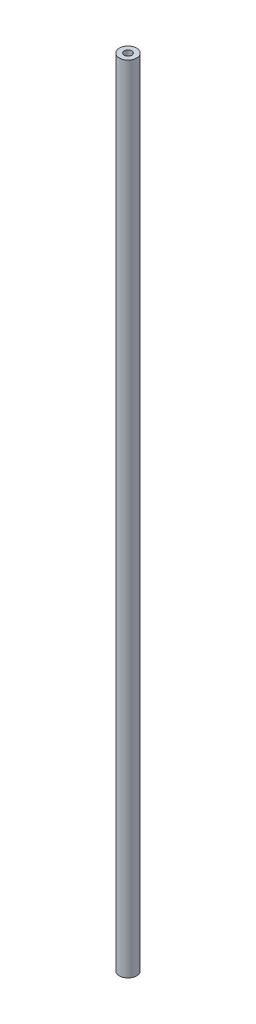
ISO-10303-21;
HEADER;
FILE_DESCRIPTION(('STEP AP214'),'2;1');
FILE_NAME('part.step','',(''),(''),'','','');
FILE_SCHEMA(('AUTOMOTIVE_DESIGN { 1 0 10303 214 1 1 1 1 }'));
ENDSEC;
DATA;
#1=APPLICATION_CONTEXT('core data for automotive mechanical design processes');
#2=APPLICATION_PROTOCOL_DEFINITION('international standard','automotive_design',2000,#1);
#3=PRODUCT_CONTEXT('',#1,'mechanical');
#4=PRODUCT('Part','Part','',(#3));
#5=PRODUCT_RELATED_PRODUCT_CATEGORY('part','',(#4));
#6=PRODUCT_DEFINITION_FORMATION('','',#4);
#7=PRODUCT_DEFINITION_CONTEXT('part definition',#1,'design');
#8=PRODUCT_DEFINITION('design','',#6,#7);
#9=PRODUCT_DEFINITION_SHAPE('','',#8);
#10=(LENGTH_UNIT() NAMED_UNIT(*) SI_UNIT(.MILLI.,.METRE.));
#11=(NAMED_UNIT(*) PLANE_ANGLE_UNIT() SI_UNIT($,.RADIAN.));
#12=(NAMED_UNIT(*) SI_UNIT($,.STERADIAN.) SOLID_ANGLE_UNIT());
#13=UNCERTAINTY_MEASURE_WITH_UNIT(LENGTH_MEASURE(1.E-05),#10,'distance_accuracy_value','');
#14=(GEOMETRIC_REPRESENTATION_CONTEXT(3) GLOBAL_UNCERTAINTY_ASSIGNED_CONTEXT((#13)) GLOBAL_UNIT_ASSIGNED_CONTEXT((#10,
#11,#12)) REPRESENTATION_CONTEXT('',''));
#15=CARTESIAN_POINT('',(0.,0.,0.));
#16=DIRECTION('',(0.,0.,1.));
#17=DIRECTION('',(1.,0.,0.));
#18=AXIS2_PLACEMENT_3D('',#15,#16,#17);
#19=CARTESIAN_POINT('',(0.,23.,0.));
#20=DIRECTION('',(0.,1.,0.));
#21=DIRECTION('',(0.,0.,1.));
#22=AXIS2_PLACEMENT_3D('',#19,#20,#21);
#23=PLANE('',#22);
#24=CARTESIAN_POINT('',(0.,23.,0.));
#25=DIRECTION('',(0.,1.,0.));
#26=DIRECTION('',(0.,0.,1.));
#27=AXIS2_PLACEMENT_3D('',#24,#25,#26);
#28=CIRCLE('',#27,0.25);
#29=CARTESIAN_POINT('',(0.,23.,0.25));
#30=VERTEX_POINT('',#29);
#31=EDGE_CURVE('E10',#30,#30,#28,.T.);
#32=ORIENTED_EDGE('',*,*,#31,.T.);
#33=EDGE_LOOP('',(#32));
#34=FACE_BOUND('',#33,.T.);
#35=CARTESIAN_POINT('',(0.,23.,0.));
#36=DIRECTION('',(0.,1.,0.));
#37=DIRECTION('',(0.,0.,1.));
#38=AXIS2_PLACEMENT_3D('',#35,#36,#37);
#39=CIRCLE('',#38,0.11);
#40=CARTESIAN_POINT('',(0.,23.,0.11));
#41=VERTEX_POINT('',#40);
#42=EDGE_CURVE('E42',#41,#41,#39,.T.);
#43=ORIENTED_EDGE('',*,*,#42,.F.);
#44=EDGE_LOOP('',(#43));
#45=FACE_BOUND('',#44,.T.);
#46=ADVANCED_FACE('F31',(#34,#45),#23,.T.);
#47=CARTESIAN_POINT('',(0.,0.,0.));
#48=DIRECTION('',(0.,1.,0.));
#49=DIRECTION('',(0.,0.,1.));
#50=AXIS2_PLACEMENT_3D('',#47,#48,#49);
#51=PLANE('',#50);
#52=CARTESIAN_POINT('',(0.,0.,0.));
#53=DIRECTION('',(0.,1.,0.));
#54=DIRECTION('',(0.,0.,1.));
#55=AXIS2_PLACEMENT_3D('',#52,#53,#54);
#56=CIRCLE('',#55,0.25);
#57=CARTESIAN_POINT('',(0.,0.,0.25));
#58=VERTEX_POINT('',#57);
#59=EDGE_CURVE('E35',#58,#58,#56,.T.);
#60=ORIENTED_EDGE('',*,*,#59,.F.);
#61=EDGE_LOOP('',(#60));
#62=FACE_BOUND('',#61,.T.);
#63=CARTESIAN_POINT('',(0.,0.,0.));
#64=DIRECTION('',(0.,1.,0.));
#65=DIRECTION('',(0.,0.,1.));
#66=AXIS2_PLACEMENT_3D('',#63,#64,#65);
#67=CIRCLE('',#66,0.11);
#68=CARTESIAN_POINT('',(0.,0.,0.11));
#69=VERTEX_POINT('',#68);
#70=EDGE_CURVE('E44',#69,#69,#67,.T.);
#71=ORIENTED_EDGE('',*,*,#70,.T.);
#72=EDGE_LOOP('',(#71));
#73=FACE_BOUND('',#72,.T.);
#74=ADVANCED_FACE('F54',(#62,#73),#51,.F.);
#75=CARTESIAN_POINT('',(0.,23.,0.));
#76=DIRECTION('',(0.,-1.,0.));
#77=DIRECTION('',(0.,0.,-1.));
#78=AXIS2_PLACEMENT_3D('',#75,#76,#77);
#79=CYLINDRICAL_SURFACE('',#78,0.25);
#80=ORIENTED_EDGE('',*,*,#31,.F.);
#81=EDGE_LOOP('',(#80));
#82=FACE_BOUND('',#81,.T.);
#83=ORIENTED_EDGE('',*,*,#59,.T.);
#84=EDGE_LOOP('',(#83));
#85=FACE_BOUND('',#84,.T.);
#86=ADVANCED_FACE('F33',(#82,#85),#79,.T.);
#87=CARTESIAN_POINT('',(0.,23.,0.));
#88=DIRECTION('',(0.,-1.,0.));
#89=DIRECTION('',(0.,0.,-1.));
#90=AXIS2_PLACEMENT_3D('',#87,#88,#89);
#91=CYLINDRICAL_SURFACE('',#90,0.11);
#92=ORIENTED_EDGE('',*,*,#42,.T.);
#93=EDGE_LOOP('',(#92));
#94=FACE_BOUND('',#93,.T.);
#95=ORIENTED_EDGE('',*,*,#70,.F.);
#96=EDGE_LOOP('',(#95));
#97=FACE_BOUND('',#96,.T.);
#98=ADVANCED_FACE('F50',(#94,#97),#91,.F.);
#99=CLOSED_SHELL('',(#46,#74,#86,#98));
#100=MANIFOLD_SOLID_BREP('B2',#99);
#101=ADVANCED_BREP_SHAPE_REPRESENTATION('',(#18,#100),#14);
#102=SHAPE_DEFINITION_REPRESENTATION(#9,#101);
ENDSEC;
END-ISO-10303-21;
